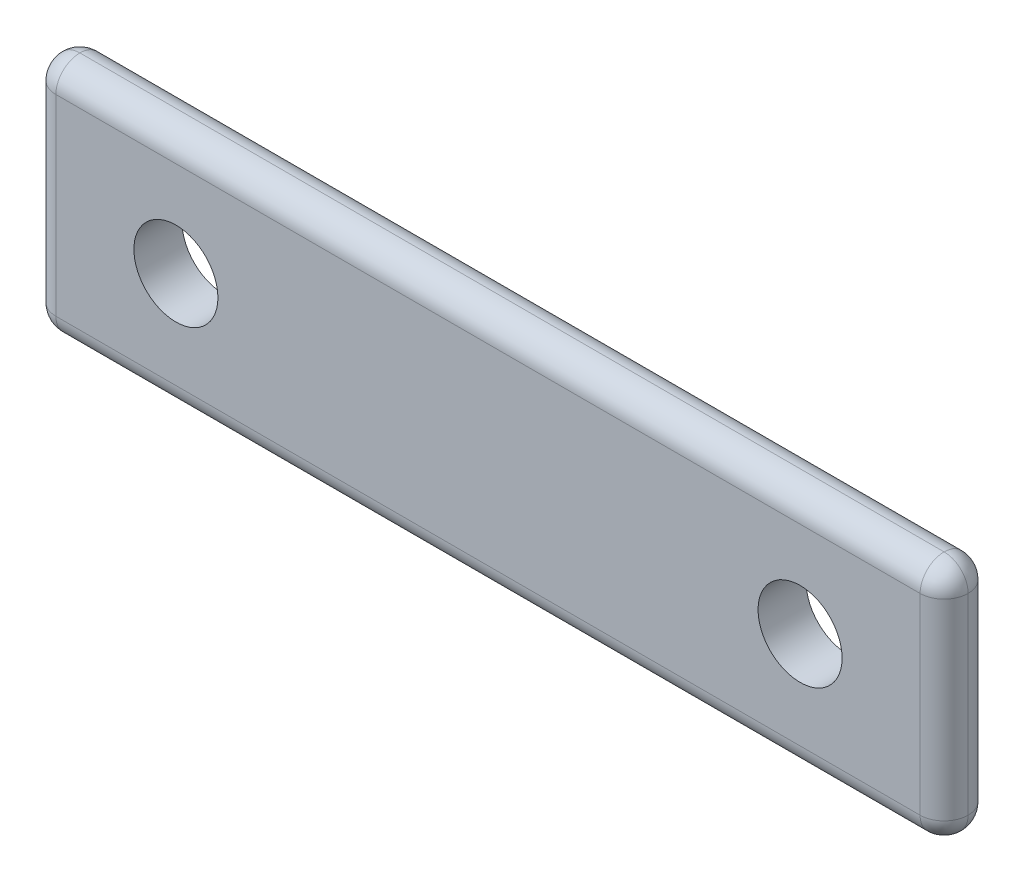
ISO-10303-21;
HEADER;
FILE_DESCRIPTION(('STEP AP214'),'2;1');
FILE_NAME('part.step','',(''),(''),'','','');
FILE_SCHEMA(('AUTOMOTIVE_DESIGN { 1 0 10303 214 1 1 1 1 }'));
ENDSEC;
DATA;
#1=APPLICATION_CONTEXT('core data for automotive mechanical design processes');
#2=APPLICATION_PROTOCOL_DEFINITION('international standard','automotive_design',2000,#1);
#3=PRODUCT_CONTEXT('',#1,'mechanical');
#4=PRODUCT('Part','Part','',(#3));
#5=PRODUCT_RELATED_PRODUCT_CATEGORY('part','',(#4));
#6=PRODUCT_DEFINITION_FORMATION('','',#4);
#7=PRODUCT_DEFINITION_CONTEXT('part definition',#1,'design');
#8=PRODUCT_DEFINITION('design','',#6,#7);
#9=PRODUCT_DEFINITION_SHAPE('','',#8);
#10=(LENGTH_UNIT() NAMED_UNIT(*) SI_UNIT(.MILLI.,.METRE.));
#11=(NAMED_UNIT(*) PLANE_ANGLE_UNIT() SI_UNIT($,.RADIAN.));
#12=(NAMED_UNIT(*) SI_UNIT($,.STERADIAN.) SOLID_ANGLE_UNIT());
#13=UNCERTAINTY_MEASURE_WITH_UNIT(LENGTH_MEASURE(1.E-05),#10,'distance_accuracy_value','');
#14=(GEOMETRIC_REPRESENTATION_CONTEXT(3) GLOBAL_UNCERTAINTY_ASSIGNED_CONTEXT((#13)) GLOBAL_UNIT_ASSIGNED_CONTEXT((#10,
#11,#12)) REPRESENTATION_CONTEXT('',''));
#15=CARTESIAN_POINT('',(0.,0.,0.));
#16=DIRECTION('',(0.,0.,1.));
#17=DIRECTION('',(1.,0.,0.));
#18=AXIS2_PLACEMENT_3D('',#15,#16,#17);
#19=CARTESIAN_POINT('',(0.,0.,10.));
#20=DIRECTION('',(0.,0.,-1.));
#21=DIRECTION('',(-1.,0.,0.));
#22=AXIS2_PLACEMENT_3D('',#19,#20,#21);
#23=PLANE('',#22);
#24=CARTESIAN_POINT('',(30.,25.2068655717166,10.));
#25=DIRECTION('',(0.,0.,1.));
#26=DIRECTION('',(1.,0.,0.));
#27=AXIS2_PLACEMENT_3D('',#24,#25,#26);
#28=CIRCLE('',#27,8.75);
#29=CARTESIAN_POINT('',(38.75,25.2068655717166,10.));
#30=VERTEX_POINT('',#29);
#31=EDGE_CURVE('E434',#30,#30,#28,.T.);
#32=ORIENTED_EDGE('',*,*,#31,.F.);
#33=EDGE_LOOP('',(#32));
#34=FACE_BOUND('',#33,.T.);
#35=CARTESIAN_POINT('',(160.,25.2068655717166,10.));
#36=DIRECTION('',(0.,0.,1.));
#37=DIRECTION('',(1.,0.,0.));
#38=AXIS2_PLACEMENT_3D('',#35,#36,#37);
#39=CIRCLE('',#38,8.75000000000001);
#40=CARTESIAN_POINT('',(168.75,25.2068655717166,10.));
#41=VERTEX_POINT('',#40);
#42=EDGE_CURVE('E438',#41,#41,#39,.T.);
#43=ORIENTED_EDGE('',*,*,#42,.F.);
#44=EDGE_LOOP('',(#43));
#45=FACE_BOUND('',#44,.T.);
#46=DIRECTION('',(0.,-1.,0.));
#47=VECTOR('',#46,1.);
#48=CARTESIAN_POINT('',(5.,0.,10.));
#49=LINE('',#48,#47);
#50=CARTESIAN_POINT('',(5.,45.,10.));
#51=VERTEX_POINT('',#50);
#52=CARTESIAN_POINT('',(5.,5.,10.));
#53=VERTEX_POINT('',#52);
#54=EDGE_CURVE('E116',#51,#53,#49,.T.);
#55=ORIENTED_EDGE('',*,*,#54,.T.);
#56=DIRECTION('',(1.,0.,0.));
#57=VECTOR('',#56,1.);
#58=CARTESIAN_POINT('',(0.,5.,10.));
#59=LINE('',#58,#57);
#60=CARTESIAN_POINT('',(185.,5.,10.));
#61=VERTEX_POINT('',#60);
#62=EDGE_CURVE('E11',#53,#61,#59,.T.);
#63=ORIENTED_EDGE('',*,*,#62,.T.);
#64=DIRECTION('',(0.,1.,0.));
#65=VECTOR('',#64,1.);
#66=CARTESIAN_POINT('',(185.,0.,10.));
#67=LINE('',#66,#65);
#68=CARTESIAN_POINT('',(185.,45.,10.));
#69=VERTEX_POINT('',#68);
#70=EDGE_CURVE('E50',#61,#69,#67,.T.);
#71=ORIENTED_EDGE('',*,*,#70,.T.);
#72=DIRECTION('',(-1.,0.,0.));
#73=VECTOR('',#72,1.);
#74=CARTESIAN_POINT('',(0.,45.,10.));
#75=LINE('',#74,#73);
#76=EDGE_CURVE('E115',#69,#51,#75,.T.);
#77=ORIENTED_EDGE('',*,*,#76,.T.);
#78=EDGE_LOOP('',(#55,#63,#71,#77));
#79=FACE_BOUND('',#78,.T.);
#80=ADVANCED_FACE('F39',(#34,#45,#79),#23,.F.);
#81=CARTESIAN_POINT('',(0.,0.,0.));
#82=DIRECTION('',(0.,0.,-1.));
#83=DIRECTION('',(-1.,0.,0.));
#84=AXIS2_PLACEMENT_3D('',#81,#82,#83);
#85=PLANE('',#84);
#86=CARTESIAN_POINT('',(30.,25.2068655717166,0.));
#87=DIRECTION('',(0.,0.,1.));
#88=DIRECTION('',(1.,0.,0.));
#89=AXIS2_PLACEMENT_3D('',#86,#87,#88);
#90=CIRCLE('',#89,8.74999999999999);
#91=CARTESIAN_POINT('',(38.75,25.2068655717166,0.));
#92=VERTEX_POINT('',#91);
#93=EDGE_CURVE('E432',#92,#92,#90,.T.);
#94=ORIENTED_EDGE('',*,*,#93,.T.);
#95=EDGE_LOOP('',(#94));
#96=FACE_BOUND('',#95,.T.);
#97=CARTESIAN_POINT('',(160.,25.2068655717166,0.));
#98=DIRECTION('',(0.,0.,1.));
#99=DIRECTION('',(1.,0.,0.));
#100=AXIS2_PLACEMENT_3D('',#97,#98,#99);
#101=CIRCLE('',#100,8.75000000000001);
#102=CARTESIAN_POINT('',(168.75,25.2068655717166,0.));
#103=VERTEX_POINT('',#102);
#104=EDGE_CURVE('E181',#103,#103,#101,.T.);
#105=ORIENTED_EDGE('',*,*,#104,.T.);
#106=EDGE_LOOP('',(#105));
#107=FACE_BOUND('',#106,.T.);
#108=DIRECTION('',(0.,1.,0.));
#109=VECTOR('',#108,1.);
#110=CARTESIAN_POINT('',(185.,0.,0.));
#111=LINE('',#110,#109);
#112=CARTESIAN_POINT('',(185.,45.,0.));
#113=VERTEX_POINT('',#112);
#114=CARTESIAN_POINT('',(185.,5.,0.));
#115=VERTEX_POINT('',#114);
#116=EDGE_CURVE('E178',#113,#115,#111,.F.);
#117=ORIENTED_EDGE('',*,*,#116,.T.);
#118=DIRECTION('',(1.,0.,0.));
#119=VECTOR('',#118,1.);
#120=CARTESIAN_POINT('',(0.,5.,0.));
#121=LINE('',#120,#119);
#122=CARTESIAN_POINT('',(5.,5.,0.));
#123=VERTEX_POINT('',#122);
#124=EDGE_CURVE('E122',#115,#123,#121,.F.);
#125=ORIENTED_EDGE('',*,*,#124,.T.);
#126=DIRECTION('',(0.,-1.,0.));
#127=VECTOR('',#126,1.);
#128=CARTESIAN_POINT('',(5.,50.,0.));
#129=LINE('',#128,#127);
#130=CARTESIAN_POINT('',(5.,45.,0.));
#131=VERTEX_POINT('',#130);
#132=EDGE_CURVE('E102',#123,#131,#129,.F.);
#133=ORIENTED_EDGE('',*,*,#132,.T.);
#134=DIRECTION('',(-1.,0.,0.));
#135=VECTOR('',#134,1.);
#136=CARTESIAN_POINT('',(190.,45.,0.));
#137=LINE('',#136,#135);
#138=EDGE_CURVE('E172',#131,#113,#137,.F.);
#139=ORIENTED_EDGE('',*,*,#138,.T.);
#140=EDGE_LOOP('',(#117,#125,#133,#139));
#141=FACE_BOUND('',#140,.T.);
#142=ADVANCED_FACE('F257',(#96,#107,#141),#85,.T.);
#143=CARTESIAN_POINT('',(5.,0.,5.));
#144=DIRECTION('',(0.,-1.,0.));
#145=DIRECTION('',(0.,0.,-1.));
#146=AXIS2_PLACEMENT_3D('',#143,#144,#145);
#147=CYLINDRICAL_SURFACE('',#146,5.);
#148=DIRECTION('',(0.,-1.,0.));
#149=VECTOR('',#148,1.);
#150=CARTESIAN_POINT('',(0.,0.,5.));
#151=LINE('',#150,#149);
#152=CARTESIAN_POINT('',(0.,5.,5.));
#153=VERTEX_POINT('',#152);
#154=CARTESIAN_POINT('',(0.,45.,5.));
#155=VERTEX_POINT('',#154);
#156=EDGE_CURVE('E158',#153,#155,#151,.F.);
#157=ORIENTED_EDGE('',*,*,#156,.F.);
#158=CARTESIAN_POINT('',(5.,5.,5.));
#159=DIRECTION('',(0.,-1.,0.));
#160=DIRECTION('',(0.,0.,-1.));
#161=AXIS2_PLACEMENT_3D('',#158,#159,#160);
#162=CIRCLE('',#161,5.);
#163=EDGE_CURVE('E43',#53,#153,#162,.T.);
#164=ORIENTED_EDGE('',*,*,#163,.F.);
#165=ORIENTED_EDGE('',*,*,#54,.F.);
#166=CARTESIAN_POINT('',(5.,45.,5.));
#167=DIRECTION('',(0.,1.,0.));
#168=DIRECTION('',(0.,0.,1.));
#169=AXIS2_PLACEMENT_3D('',#166,#167,#168);
#170=CIRCLE('',#169,5.);
#171=EDGE_CURVE('E86',#155,#51,#170,.T.);
#172=ORIENTED_EDGE('',*,*,#171,.F.);
#173=EDGE_LOOP('',(#157,#164,#165,#172));
#174=FACE_BOUND('',#173,.T.);
#175=ADVANCED_FACE('F41',(#174),#147,.T.);
#176=CARTESIAN_POINT('',(5.,5.,5.));
#177=DIRECTION('',(-1.,0.,0.));
#178=DIRECTION('',(0.,0.,1.));
#179=AXIS2_PLACEMENT_3D('',#176,#177,#178);
#180=SPHERICAL_SURFACE('',#179,5.);
#181=ORIENTED_EDGE('',*,*,#163,.T.);
#182=CARTESIAN_POINT('',(5.,5.,5.));
#183=DIRECTION('',(0.,0.,-1.));
#184=DIRECTION('',(-1.,0.,0.));
#185=AXIS2_PLACEMENT_3D('',#182,#183,#184);
#186=CIRCLE('',#185,5.);
#187=CARTESIAN_POINT('',(5.,0.,5.));
#188=VERTEX_POINT('',#187);
#189=EDGE_CURVE('E93',#188,#153,#186,.T.);
#190=ORIENTED_EDGE('',*,*,#189,.F.);
#191=CARTESIAN_POINT('',(5.,5.,5.));
#192=DIRECTION('',(-1.,0.,0.));
#193=DIRECTION('',(0.,0.,1.));
#194=AXIS2_PLACEMENT_3D('',#191,#192,#193);
#195=CIRCLE('',#194,5.);
#196=EDGE_CURVE('E141',#53,#188,#195,.F.);
#197=ORIENTED_EDGE('',*,*,#196,.F.);
#198=EDGE_LOOP('',(#181,#190,#197));
#199=FACE_BOUND('',#198,.T.);
#200=ADVANCED_FACE('F170',(#199),#180,.T.);
#201=CARTESIAN_POINT('',(5.,45.,5.));
#202=DIRECTION('',(-1.,0.,0.));
#203=DIRECTION('',(0.,0.,1.));
#204=AXIS2_PLACEMENT_3D('',#201,#202,#203);
#205=SPHERICAL_SURFACE('',#204,5.);
#206=CARTESIAN_POINT('',(5.,45.,5.));
#207=DIRECTION('',(0.,0.,1.));
#208=DIRECTION('',(1.,0.,0.));
#209=AXIS2_PLACEMENT_3D('',#206,#207,#208);
#210=CIRCLE('',#209,5.);
#211=CARTESIAN_POINT('',(5.,50.,5.));
#212=VERTEX_POINT('',#211);
#213=EDGE_CURVE('E132',#155,#212,#210,.F.);
#214=ORIENTED_EDGE('',*,*,#213,.F.);
#215=ORIENTED_EDGE('',*,*,#171,.T.);
#216=CARTESIAN_POINT('',(5.,45.,5.));
#217=DIRECTION('',(-1.,0.,0.));
#218=DIRECTION('',(0.,0.,1.));
#219=AXIS2_PLACEMENT_3D('',#216,#217,#218);
#220=CIRCLE('',#219,5.);
#221=EDGE_CURVE('E130',#212,#51,#220,.F.);
#222=ORIENTED_EDGE('',*,*,#221,.F.);
#223=EDGE_LOOP('',(#214,#215,#222));
#224=FACE_BOUND('',#223,.T.);
#225=ADVANCED_FACE('F129',(#224),#205,.T.);
#226=CARTESIAN_POINT('',(5.,0.,5.));
#227=DIRECTION('',(0.,1.,0.));
#228=DIRECTION('',(0.,0.,1.));
#229=AXIS2_PLACEMENT_3D('',#226,#227,#228);
#230=CYLINDRICAL_SURFACE('',#229,5.);
#231=CARTESIAN_POINT('',(5.,5.,5.));
#232=DIRECTION('',(0.,-1.,0.));
#233=DIRECTION('',(0.,0.,-1.));
#234=AXIS2_PLACEMENT_3D('',#231,#232,#233);
#235=CIRCLE('',#234,5.);
#236=EDGE_CURVE('E155',#153,#123,#235,.T.);
#237=ORIENTED_EDGE('',*,*,#236,.F.);
#238=ORIENTED_EDGE('',*,*,#156,.T.);
#239=CARTESIAN_POINT('',(5.,45.,5.));
#240=DIRECTION('',(0.,1.,0.));
#241=DIRECTION('',(0.,0.,1.));
#242=AXIS2_PLACEMENT_3D('',#239,#240,#241);
#243=CIRCLE('',#242,5.);
#244=EDGE_CURVE('E142',#131,#155,#243,.T.);
#245=ORIENTED_EDGE('',*,*,#244,.F.);
#246=ORIENTED_EDGE('',*,*,#132,.F.);
#247=EDGE_LOOP('',(#237,#238,#245,#246));
#248=FACE_BOUND('',#247,.T.);
#249=ADVANCED_FACE('F168',(#248),#230,.T.);
#250=CARTESIAN_POINT('',(5.,5.,5.));
#251=DIRECTION('',(-1.,0.,0.));
#252=DIRECTION('',(0.,0.,1.));
#253=AXIS2_PLACEMENT_3D('',#250,#251,#252);
#254=SPHERICAL_SURFACE('',#253,5.);
#255=ORIENTED_EDGE('',*,*,#189,.T.);
#256=ORIENTED_EDGE('',*,*,#236,.T.);
#257=CARTESIAN_POINT('',(5.,5.,5.));
#258=DIRECTION('',(-1.,0.,0.));
#259=DIRECTION('',(0.,-1.,0.));
#260=AXIS2_PLACEMENT_3D('',#257,#258,#259);
#261=CIRCLE('',#260,5.);
#262=EDGE_CURVE('E149',#188,#123,#261,.F.);
#263=ORIENTED_EDGE('',*,*,#262,.F.);
#264=EDGE_LOOP('',(#255,#256,#263));
#265=FACE_BOUND('',#264,.T.);
#266=ADVANCED_FACE('F245',(#265),#254,.T.);
#267=CARTESIAN_POINT('',(0.,5.,5.));
#268=DIRECTION('',(1.,0.,0.));
#269=DIRECTION('',(0.,1.,0.));
#270=AXIS2_PLACEMENT_3D('',#267,#268,#269);
#271=CYLINDRICAL_SURFACE('',#270,5.);
#272=ORIENTED_EDGE('',*,*,#62,.F.);
#273=ORIENTED_EDGE('',*,*,#196,.T.);
#274=DIRECTION('',(1.,0.,0.));
#275=VECTOR('',#274,1.);
#276=CARTESIAN_POINT('',(190.,0.,5.));
#277=LINE('',#276,#275);
#278=CARTESIAN_POINT('',(185.,0.,5.));
#279=VERTEX_POINT('',#278);
#280=EDGE_CURVE('E236',#279,#188,#277,.F.);
#281=ORIENTED_EDGE('',*,*,#280,.F.);
#282=CARTESIAN_POINT('',(185.,5.,5.));
#283=DIRECTION('',(1.,0.,0.));
#284=DIRECTION('',(0.,0.,-1.));
#285=AXIS2_PLACEMENT_3D('',#282,#283,#284);
#286=CIRCLE('',#285,5.);
#287=EDGE_CURVE('E232',#61,#279,#286,.T.);
#288=ORIENTED_EDGE('',*,*,#287,.F.);
#289=EDGE_LOOP('',(#272,#273,#281,#288));
#290=FACE_BOUND('',#289,.T.);
#291=ADVANCED_FACE('F247',(#290),#271,.T.);
#292=CARTESIAN_POINT('',(0.,45.,5.));
#293=DIRECTION('',(-1.,0.,0.));
#294=DIRECTION('',(0.,0.,1.));
#295=AXIS2_PLACEMENT_3D('',#292,#293,#294);
#296=CYLINDRICAL_SURFACE('',#295,5.);
#297=ORIENTED_EDGE('',*,*,#221,.T.);
#298=ORIENTED_EDGE('',*,*,#76,.F.);
#299=CARTESIAN_POINT('',(185.,45.,5.));
#300=DIRECTION('',(1.,0.,0.));
#301=DIRECTION('',(0.,0.,-1.));
#302=AXIS2_PLACEMENT_3D('',#299,#300,#301);
#303=CIRCLE('',#302,5.);
#304=CARTESIAN_POINT('',(185.,50.,5.));
#305=VERTEX_POINT('',#304);
#306=EDGE_CURVE('E228',#305,#69,#303,.T.);
#307=ORIENTED_EDGE('',*,*,#306,.F.);
#308=DIRECTION('',(-1.,0.,0.));
#309=VECTOR('',#308,1.);
#310=CARTESIAN_POINT('',(0.,50.,5.));
#311=LINE('',#310,#309);
#312=EDGE_CURVE('E138',#212,#305,#311,.F.);
#313=ORIENTED_EDGE('',*,*,#312,.F.);
#314=EDGE_LOOP('',(#297,#298,#307,#313));
#315=FACE_BOUND('',#314,.T.);
#316=ADVANCED_FACE('F136',(#315),#296,.T.);
#317=CARTESIAN_POINT('',(5.,45.,5.));
#318=DIRECTION('',(-1.,0.,0.));
#319=DIRECTION('',(0.,0.,1.));
#320=AXIS2_PLACEMENT_3D('',#317,#318,#319);
#321=SPHERICAL_SURFACE('',#320,5.);
#322=ORIENTED_EDGE('',*,*,#244,.T.);
#323=ORIENTED_EDGE('',*,*,#213,.T.);
#324=CARTESIAN_POINT('',(5.,45.,5.));
#325=DIRECTION('',(-1.,0.,0.));
#326=DIRECTION('',(0.,0.,1.));
#327=AXIS2_PLACEMENT_3D('',#324,#325,#326);
#328=CIRCLE('',#327,5.);
#329=EDGE_CURVE('E165',#131,#212,#328,.F.);
#330=ORIENTED_EDGE('',*,*,#329,.F.);
#331=EDGE_LOOP('',(#322,#323,#330));
#332=FACE_BOUND('',#331,.T.);
#333=ADVANCED_FACE('F164',(#332),#321,.T.);
#334=CARTESIAN_POINT('',(190.,5.,5.));
#335=DIRECTION('',(-1.,0.,0.));
#336=DIRECTION('',(0.,-1.,0.));
#337=AXIS2_PLACEMENT_3D('',#334,#335,#336);
#338=CYLINDRICAL_SURFACE('',#337,5.);
#339=CARTESIAN_POINT('',(185.,5.,5.));
#340=DIRECTION('',(1.,0.,0.));
#341=DIRECTION('',(0.,0.,-1.));
#342=AXIS2_PLACEMENT_3D('',#339,#340,#341);
#343=CIRCLE('',#342,5.);
#344=EDGE_CURVE('E216',#279,#115,#343,.T.);
#345=ORIENTED_EDGE('',*,*,#344,.F.);
#346=ORIENTED_EDGE('',*,*,#280,.T.);
#347=ORIENTED_EDGE('',*,*,#262,.T.);
#348=ORIENTED_EDGE('',*,*,#124,.F.);
#349=EDGE_LOOP('',(#345,#346,#347,#348));
#350=FACE_BOUND('',#349,.T.);
#351=ADVANCED_FACE('F244',(#350),#338,.T.);
#352=CARTESIAN_POINT('',(185.,5.,5.));
#353=DIRECTION('',(0.,-1.,0.));
#354=DIRECTION('',(0.,0.,-1.));
#355=AXIS2_PLACEMENT_3D('',#352,#353,#354);
#356=SPHERICAL_SURFACE('',#355,5.);
#357=ORIENTED_EDGE('',*,*,#287,.T.);
#358=CARTESIAN_POINT('',(185.,5.,5.));
#359=DIRECTION('',(0.,0.,-1.));
#360=DIRECTION('',(-1.,0.,0.));
#361=AXIS2_PLACEMENT_3D('',#358,#359,#360);
#362=CIRCLE('',#361,5.);
#363=CARTESIAN_POINT('',(190.,5.,5.));
#364=VERTEX_POINT('',#363);
#365=EDGE_CURVE('E212',#364,#279,#362,.T.);
#366=ORIENTED_EDGE('',*,*,#365,.F.);
#367=CARTESIAN_POINT('',(185.,5.,5.));
#368=DIRECTION('',(0.,-1.,0.));
#369=DIRECTION('',(0.,0.,-1.));
#370=AXIS2_PLACEMENT_3D('',#367,#368,#369);
#371=CIRCLE('',#370,5.);
#372=EDGE_CURVE('E208',#61,#364,#371,.F.);
#373=ORIENTED_EDGE('',*,*,#372,.F.);
#374=EDGE_LOOP('',(#357,#366,#373));
#375=FACE_BOUND('',#374,.T.);
#376=ADVANCED_FACE('F294',(#375),#356,.T.);
#377=CARTESIAN_POINT('',(185.,45.,5.));
#378=DIRECTION('',(0.,1.,0.));
#379=DIRECTION('',(0.,0.,1.));
#380=AXIS2_PLACEMENT_3D('',#377,#378,#379);
#381=SPHERICAL_SURFACE('',#380,5.);
#382=CARTESIAN_POINT('',(185.,45.,5.));
#383=DIRECTION('',(0.,0.,1.));
#384=DIRECTION('',(1.,0.,0.));
#385=AXIS2_PLACEMENT_3D('',#382,#383,#384);
#386=CIRCLE('',#385,5.);
#387=CARTESIAN_POINT('',(190.,45.,5.));
#388=VERTEX_POINT('',#387);
#389=EDGE_CURVE('E224',#305,#388,#386,.F.);
#390=ORIENTED_EDGE('',*,*,#389,.F.);
#391=ORIENTED_EDGE('',*,*,#306,.T.);
#392=CARTESIAN_POINT('',(185.,45.,5.));
#393=DIRECTION('',(0.,1.,0.));
#394=DIRECTION('',(0.,0.,1.));
#395=AXIS2_PLACEMENT_3D('',#392,#393,#394);
#396=CIRCLE('',#395,5.);
#397=EDGE_CURVE('E205',#388,#69,#396,.F.);
#398=ORIENTED_EDGE('',*,*,#397,.F.);
#399=EDGE_LOOP('',(#390,#391,#398));
#400=FACE_BOUND('',#399,.T.);
#401=ADVANCED_FACE('F290',(#400),#381,.T.);
#402=CARTESIAN_POINT('',(0.,45.,5.));
#403=DIRECTION('',(1.,0.,0.));
#404=DIRECTION('',(0.,0.,-1.));
#405=AXIS2_PLACEMENT_3D('',#402,#403,#404);
#406=CYLINDRICAL_SURFACE('',#405,5.);
#407=ORIENTED_EDGE('',*,*,#329,.T.);
#408=ORIENTED_EDGE('',*,*,#312,.T.);
#409=CARTESIAN_POINT('',(185.,45.,5.));
#410=DIRECTION('',(1.,0.,0.));
#411=DIRECTION('',(0.,0.,-1.));
#412=AXIS2_PLACEMENT_3D('',#409,#410,#411);
#413=CIRCLE('',#412,5.);
#414=EDGE_CURVE('E201',#113,#305,#413,.T.);
#415=ORIENTED_EDGE('',*,*,#414,.F.);
#416=ORIENTED_EDGE('',*,*,#138,.F.);
#417=EDGE_LOOP('',(#407,#408,#415,#416));
#418=FACE_BOUND('',#417,.T.);
#419=ADVANCED_FACE('F286',(#418),#406,.T.);
#420=CARTESIAN_POINT('',(185.,5.,5.));
#421=DIRECTION('',(0.,-1.,0.));
#422=DIRECTION('',(0.,0.,-1.));
#423=AXIS2_PLACEMENT_3D('',#420,#421,#422);
#424=SPHERICAL_SURFACE('',#423,5.);
#425=ORIENTED_EDGE('',*,*,#365,.T.);
#426=ORIENTED_EDGE('',*,*,#344,.T.);
#427=CARTESIAN_POINT('',(185.,5.,5.));
#428=DIRECTION('',(0.,-1.,0.));
#429=DIRECTION('',(1.,0.,0.));
#430=AXIS2_PLACEMENT_3D('',#427,#428,#429);
#431=CIRCLE('',#430,5.);
#432=EDGE_CURVE('E198',#364,#115,#431,.F.);
#433=ORIENTED_EDGE('',*,*,#432,.F.);
#434=EDGE_LOOP('',(#425,#426,#433));
#435=FACE_BOUND('',#434,.T.);
#436=ADVANCED_FACE('F282',(#435),#424,.T.);
#437=CARTESIAN_POINT('',(185.,0.,5.));
#438=DIRECTION('',(0.,1.,0.));
#439=DIRECTION('',(0.,0.,1.));
#440=AXIS2_PLACEMENT_3D('',#437,#438,#439);
#441=CYLINDRICAL_SURFACE('',#440,5.);
#442=ORIENTED_EDGE('',*,*,#70,.F.);
#443=ORIENTED_EDGE('',*,*,#372,.T.);
#444=DIRECTION('',(0.,1.,0.));
#445=VECTOR('',#444,1.);
#446=CARTESIAN_POINT('',(190.,50.,5.));
#447=LINE('',#446,#445);
#448=EDGE_CURVE('E194',#388,#364,#447,.F.);
#449=ORIENTED_EDGE('',*,*,#448,.F.);
#450=ORIENTED_EDGE('',*,*,#397,.T.);
#451=EDGE_LOOP('',(#442,#443,#449,#450));
#452=FACE_BOUND('',#451,.T.);
#453=ADVANCED_FACE('F278',(#452),#441,.T.);
#454=CARTESIAN_POINT('',(185.,45.,5.));
#455=DIRECTION('',(0.,1.,0.));
#456=DIRECTION('',(0.,0.,1.));
#457=AXIS2_PLACEMENT_3D('',#454,#455,#456);
#458=SPHERICAL_SURFACE('',#457,5.);
#459=ORIENTED_EDGE('',*,*,#414,.T.);
#460=ORIENTED_EDGE('',*,*,#389,.T.);
#461=CARTESIAN_POINT('',(185.,45.,5.));
#462=DIRECTION('',(0.,1.,0.));
#463=DIRECTION('',(0.,0.,1.));
#464=AXIS2_PLACEMENT_3D('',#461,#462,#463);
#465=CIRCLE('',#464,5.);
#466=EDGE_CURVE('E190',#113,#388,#465,.F.);
#467=ORIENTED_EDGE('',*,*,#466,.F.);
#468=EDGE_LOOP('',(#459,#460,#467));
#469=FACE_BOUND('',#468,.T.);
#470=ADVANCED_FACE('F274',(#469),#458,.T.);
#471=CARTESIAN_POINT('',(185.,50.,5.));
#472=DIRECTION('',(0.,-1.,0.));
#473=DIRECTION('',(0.,0.,-1.));
#474=AXIS2_PLACEMENT_3D('',#471,#472,#473);
#475=CYLINDRICAL_SURFACE('',#474,5.);
#476=ORIENTED_EDGE('',*,*,#432,.T.);
#477=ORIENTED_EDGE('',*,*,#116,.F.);
#478=ORIENTED_EDGE('',*,*,#466,.T.);
#479=ORIENTED_EDGE('',*,*,#448,.T.);
#480=EDGE_LOOP('',(#476,#477,#478,#479));
#481=FACE_BOUND('',#480,.T.);
#482=ADVANCED_FACE('F271',(#481),#475,.T.);
#483=CARTESIAN_POINT('',(160.,25.2068655717166,10.));
#484=DIRECTION('',(0.,0.,1.));
#485=DIRECTION('',(1.,0.,0.));
#486=AXIS2_PLACEMENT_3D('',#483,#484,#485);
#487=CYLINDRICAL_SURFACE('',#486,8.75000000000001);
#488=ORIENTED_EDGE('',*,*,#104,.F.);
#489=EDGE_LOOP('',(#488));
#490=FACE_BOUND('',#489,.T.);
#491=ORIENTED_EDGE('',*,*,#42,.T.);
#492=EDGE_LOOP('',(#491));
#493=FACE_BOUND('',#492,.T.);
#494=ADVANCED_FACE('F268',(#490,#493),#487,.F.);
#495=CARTESIAN_POINT('',(30.,25.2068655717166,10.));
#496=DIRECTION('',(0.,0.,1.));
#497=DIRECTION('',(1.,0.,0.));
#498=AXIS2_PLACEMENT_3D('',#495,#496,#497);
#499=CYLINDRICAL_SURFACE('',#498,8.75);
#500=ORIENTED_EDGE('',*,*,#93,.F.);
#501=EDGE_LOOP('',(#500));
#502=FACE_BOUND('',#501,.T.);
#503=ORIENTED_EDGE('',*,*,#31,.T.);
#504=EDGE_LOOP('',(#503));
#505=FACE_BOUND('',#504,.T.);
#506=ADVANCED_FACE('F350',(#502,#505),#499,.F.);
#507=CLOSED_SHELL('',(#80,#142,#175,#200,#225,#249,#266,#291,#316,#333,#351,#376,#401,#419,#436,
#453,#470,#482,#494,#506));
#508=MANIFOLD_SOLID_BREP('B2',#507);
#509=ADVANCED_BREP_SHAPE_REPRESENTATION('',(#18,#508),#14);
#510=SHAPE_DEFINITION_REPRESENTATION(#9,#509);
ENDSEC;
END-ISO-10303-21;
